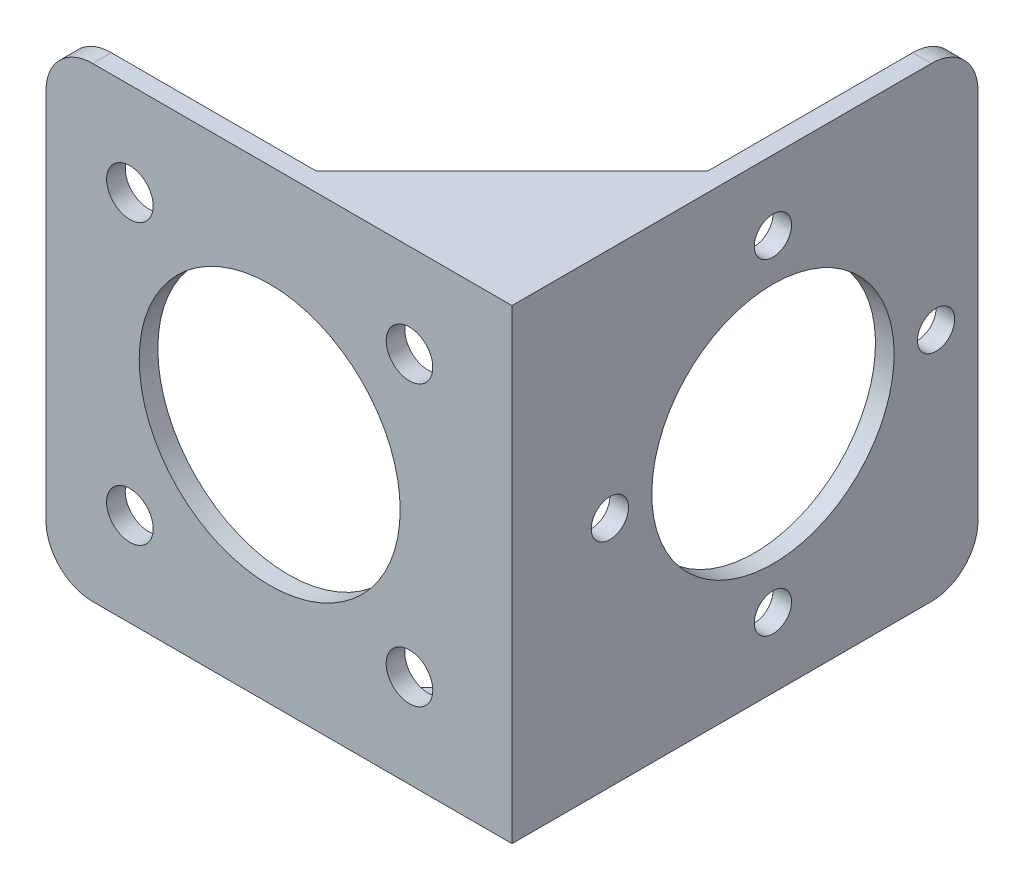
ISO-10303-21;
HEADER;
FILE_DESCRIPTION(('STEP AP214'),'2;1');
FILE_NAME('part.step','',(''),(''),'','','');
FILE_SCHEMA(('AUTOMOTIVE_DESIGN { 1 0 10303 214 1 1 1 1 }'));
ENDSEC;
DATA;
#1=APPLICATION_CONTEXT('core data for automotive mechanical design processes');
#2=APPLICATION_PROTOCOL_DEFINITION('international standard','automotive_design',2000,#1);
#3=PRODUCT_CONTEXT('',#1,'mechanical');
#4=PRODUCT('Part','Part','',(#3));
#5=PRODUCT_RELATED_PRODUCT_CATEGORY('part','',(#4));
#6=PRODUCT_DEFINITION_FORMATION('','',#4);
#7=PRODUCT_DEFINITION_CONTEXT('part definition',#1,'design');
#8=PRODUCT_DEFINITION('design','',#6,#7);
#9=PRODUCT_DEFINITION_SHAPE('','',#8);
#10=(LENGTH_UNIT() NAMED_UNIT(*) SI_UNIT(.MILLI.,.METRE.));
#11=(NAMED_UNIT(*) PLANE_ANGLE_UNIT() SI_UNIT($,.RADIAN.));
#12=(NAMED_UNIT(*) SI_UNIT($,.STERADIAN.) SOLID_ANGLE_UNIT());
#13=UNCERTAINTY_MEASURE_WITH_UNIT(LENGTH_MEASURE(1.E-05),#10,'distance_accuracy_value','');
#14=(GEOMETRIC_REPRESENTATION_CONTEXT(3) GLOBAL_UNCERTAINTY_ASSIGNED_CONTEXT((#13)) GLOBAL_UNIT_ASSIGNED_CONTEXT((#10,
#11,#12)) REPRESENTATION_CONTEXT('',''));
#15=CARTESIAN_POINT('',(0.,0.,0.));
#16=DIRECTION('',(0.,0.,1.));
#17=DIRECTION('',(1.,0.,0.));
#18=AXIS2_PLACEMENT_3D('',#15,#16,#17);
#19=CARTESIAN_POINT('',(0.,0.,0.));
#20=DIRECTION('',(0.,0.,1.));
#21=DIRECTION('',(1.,0.,0.));
#22=AXIS2_PLACEMENT_3D('',#19,#20,#21);
#23=PLANE('',#22);
#24=CARTESIAN_POINT('',(14.,15.,0.));
#25=DIRECTION('',(0.,0.,1.));
#26=DIRECTION('',(-1.,0.,0.));
#27=AXIS2_PLACEMENT_3D('',#24,#25,#26);
#28=CIRCLE('',#27,2.5);
#29=CARTESIAN_POINT('',(11.5,15.,0.));
#30=VERTEX_POINT('',#29);
#31=EDGE_CURVE('E240',#30,#30,#28,.T.);
#32=ORIENTED_EDGE('',*,*,#31,.T.);
#33=EDGE_LOOP('',(#32));
#34=FACE_BOUND('',#33,.T.);
#35=CARTESIAN_POINT('',(14.,-15.,0.));
#36=DIRECTION('',(0.,0.,1.));
#37=DIRECTION('',(1.,0.,0.));
#38=AXIS2_PLACEMENT_3D('',#35,#36,#37);
#39=CIRCLE('',#38,2.5);
#40=CARTESIAN_POINT('',(16.5,-15.,0.));
#41=VERTEX_POINT('',#40);
#42=EDGE_CURVE('E267',#41,#41,#39,.T.);
#43=ORIENTED_EDGE('',*,*,#42,.T.);
#44=EDGE_LOOP('',(#43));
#45=FACE_BOUND('',#44,.T.);
#46=CARTESIAN_POINT('',(-16.,-15.,0.));
#47=DIRECTION('',(0.,0.,1.));
#48=DIRECTION('',(-1.,0.,0.));
#49=AXIS2_PLACEMENT_3D('',#46,#47,#48);
#50=CIRCLE('',#49,2.5);
#51=CARTESIAN_POINT('',(-18.5,-15.,0.));
#52=VERTEX_POINT('',#51);
#53=EDGE_CURVE('E275',#52,#52,#50,.T.);
#54=ORIENTED_EDGE('',*,*,#53,.T.);
#55=EDGE_LOOP('',(#54));
#56=FACE_BOUND('',#55,.T.);
#57=CARTESIAN_POINT('',(-16.,15.,0.));
#58=DIRECTION('',(0.,0.,1.));
#59=DIRECTION('',(1.,0.,0.));
#60=AXIS2_PLACEMENT_3D('',#57,#58,#59);
#61=CIRCLE('',#60,2.5);
#62=CARTESIAN_POINT('',(-13.5,15.,0.));
#63=VERTEX_POINT('',#62);
#64=EDGE_CURVE('E283',#63,#63,#61,.T.);
#65=ORIENTED_EDGE('',*,*,#64,.T.);
#66=EDGE_LOOP('',(#65));
#67=FACE_BOUND('',#66,.T.);
#68=CARTESIAN_POINT('',(-0.999999999999997,0.,0.));
#69=DIRECTION('',(0.,0.,1.));
#70=DIRECTION('',(1.,0.,0.));
#71=AXIS2_PLACEMENT_3D('',#68,#69,#70);
#72=CIRCLE('',#71,14.);
#73=CARTESIAN_POINT('',(13.,0.,0.));
#74=VERTEX_POINT('',#73);
#75=EDGE_CURVE('E291',#74,#74,#72,.T.);
#76=ORIENTED_EDGE('',*,*,#75,.T.);
#77=EDGE_LOOP('',(#76));
#78=FACE_BOUND('',#77,.T.);
#79=DIRECTION('',(1.,0.,0.));
#80=VECTOR('',#79,1.);
#81=CARTESIAN_POINT('',(-25.,-25.,0.));
#82=LINE('',#81,#80);
#83=CARTESIAN_POINT('',(-20.,-25.,0.));
#84=VERTEX_POINT('',#83);
#85=CARTESIAN_POINT('',(2.,-25.,0.));
#86=VERTEX_POINT('',#85);
#87=EDGE_CURVE('E307',#84,#86,#82,.T.);
#88=ORIENTED_EDGE('',*,*,#87,.F.);
#89=CARTESIAN_POINT('',(-20.,-20.,0.));
#90=DIRECTION('',(0.,0.,1.));
#91=DIRECTION('',(1.,0.,0.));
#92=AXIS2_PLACEMENT_3D('',#89,#90,#91);
#93=CIRCLE('',#92,5.);
#94=CARTESIAN_POINT('',(-25.,-20.,0.));
#95=VERTEX_POINT('',#94);
#96=EDGE_CURVE('E195',#84,#95,#93,.F.);
#97=ORIENTED_EDGE('',*,*,#96,.T.);
#98=DIRECTION('',(0.,-1.,0.));
#99=VECTOR('',#98,1.);
#100=CARTESIAN_POINT('',(-25.,25.,0.));
#101=LINE('',#100,#99);
#102=CARTESIAN_POINT('',(-25.,20.,0.));
#103=VERTEX_POINT('',#102);
#104=EDGE_CURVE('E320',#103,#95,#101,.T.);
#105=ORIENTED_EDGE('',*,*,#104,.F.);
#106=CARTESIAN_POINT('',(-20.,20.,0.));
#107=DIRECTION('',(0.,0.,1.));
#108=DIRECTION('',(1.,0.,0.));
#109=AXIS2_PLACEMENT_3D('',#106,#107,#108);
#110=CIRCLE('',#109,5.);
#111=CARTESIAN_POINT('',(-20.,25.,0.));
#112=VERTEX_POINT('',#111);
#113=EDGE_CURVE('E192',#103,#112,#110,.F.);
#114=ORIENTED_EDGE('',*,*,#113,.T.);
#115=DIRECTION('',(-1.,0.,0.));
#116=VECTOR('',#115,1.);
#117=CARTESIAN_POINT('',(-25.,25.,0.));
#118=LINE('',#117,#116);
#119=CARTESIAN_POINT('',(1.99999999999999,25.,0.));
#120=VERTEX_POINT('',#119);
#121=EDGE_CURVE('E299',#120,#112,#118,.T.);
#122=ORIENTED_EDGE('',*,*,#121,.F.);
#123=DIRECTION('',(0.,-1.,0.));
#124=VECTOR('',#123,1.);
#125=CARTESIAN_POINT('',(2.,0.,0.));
#126=LINE('',#125,#124);
#127=CARTESIAN_POINT('',(2.,23.,0.));
#128=VERTEX_POINT('',#127);
#129=EDGE_CURVE('E162',#120,#128,#126,.T.);
#130=ORIENTED_EDGE('',*,*,#129,.T.);
#131=DIRECTION('',(-1.,0.,0.));
#132=VECTOR('',#131,1.);
#133=CARTESIAN_POINT('',(0.,23.,0.));
#134=LINE('',#133,#132);
#135=CARTESIAN_POINT('',(23.,23.,0.));
#136=VERTEX_POINT('',#135);
#137=EDGE_CURVE('E411',#136,#128,#134,.T.);
#138=ORIENTED_EDGE('',*,*,#137,.F.);
#139=DIRECTION('',(0.,1.,0.));
#140=VECTOR('',#139,1.);
#141=CARTESIAN_POINT('',(23.,25.,0.));
#142=LINE('',#141,#140);
#143=CARTESIAN_POINT('',(23.,-23.,0.));
#144=VERTEX_POINT('',#143);
#145=EDGE_CURVE('E254',#144,#136,#142,.T.);
#146=ORIENTED_EDGE('',*,*,#145,.F.);
#147=DIRECTION('',(1.,0.,0.));
#148=VECTOR('',#147,1.);
#149=CARTESIAN_POINT('',(0.,-23.,0.));
#150=LINE('',#149,#148);
#151=CARTESIAN_POINT('',(2.,-23.,0.));
#152=VERTEX_POINT('',#151);
#153=EDGE_CURVE('E389',#152,#144,#150,.T.);
#154=ORIENTED_EDGE('',*,*,#153,.F.);
#155=DIRECTION('',(0.,-1.,0.));
#156=VECTOR('',#155,1.);
#157=CARTESIAN_POINT('',(2.,0.,0.));
#158=LINE('',#157,#156);
#159=EDGE_CURVE('E165',#152,#86,#158,.T.);
#160=ORIENTED_EDGE('',*,*,#159,.T.);
#161=EDGE_LOOP('',(#88,#97,#105,#114,#122,#130,#138,#146,#154,#160));
#162=FACE_BOUND('',#161,.T.);
#163=ADVANCED_FACE('F41',(#34,#45,#56,#67,#78,#162),#23,.F.);
#164=CARTESIAN_POINT('',(0.,0.,2.));
#165=DIRECTION('',(0.,0.,1.));
#166=DIRECTION('',(1.,0.,0.));
#167=AXIS2_PLACEMENT_3D('',#164,#165,#166);
#168=PLANE('',#167);
#169=DIRECTION('',(0.,-1.,0.));
#170=VECTOR('',#169,1.);
#171=CARTESIAN_POINT('',(-25.,25.,2.));
#172=LINE('',#171,#170);
#173=CARTESIAN_POINT('',(-25.,20.,2.));
#174=VERTEX_POINT('',#173);
#175=CARTESIAN_POINT('',(-25.,-20.,2.));
#176=VERTEX_POINT('',#175);
#177=EDGE_CURVE('E311',#174,#176,#172,.T.);
#178=ORIENTED_EDGE('',*,*,#177,.T.);
#179=CARTESIAN_POINT('',(-20.,-20.,2.));
#180=DIRECTION('',(0.,0.,1.));
#181=DIRECTION('',(1.,0.,0.));
#182=AXIS2_PLACEMENT_3D('',#179,#180,#181);
#183=CIRCLE('',#182,5.);
#184=CARTESIAN_POINT('',(-20.,-25.,2.));
#185=VERTEX_POINT('',#184);
#186=EDGE_CURVE('E208',#176,#185,#183,.T.);
#187=ORIENTED_EDGE('',*,*,#186,.T.);
#188=DIRECTION('',(1.,0.,0.));
#189=VECTOR('',#188,1.);
#190=CARTESIAN_POINT('',(-25.,-25.,2.));
#191=LINE('',#190,#189);
#192=CARTESIAN_POINT('',(25.,-25.,2.));
#193=VERTEX_POINT('',#192);
#194=EDGE_CURVE('E315',#185,#193,#191,.T.);
#195=ORIENTED_EDGE('',*,*,#194,.T.);
#196=DIRECTION('',(0.,1.,0.));
#197=VECTOR('',#196,1.);
#198=CARTESIAN_POINT('',(25.,25.,2.));
#199=LINE('',#198,#197);
#200=CARTESIAN_POINT('',(25.,25.,2.));
#201=VERTEX_POINT('',#200);
#202=EDGE_CURVE('E303',#193,#201,#199,.T.);
#203=ORIENTED_EDGE('',*,*,#202,.T.);
#204=DIRECTION('',(-1.,0.,0.));
#205=VECTOR('',#204,1.);
#206=CARTESIAN_POINT('',(-25.,25.,2.));
#207=LINE('',#206,#205);
#208=CARTESIAN_POINT('',(-20.,25.,2.));
#209=VERTEX_POINT('',#208);
#210=EDGE_CURVE('E306',#201,#209,#207,.T.);
#211=ORIENTED_EDGE('',*,*,#210,.T.);
#212=CARTESIAN_POINT('',(-20.,20.,2.));
#213=DIRECTION('',(0.,0.,1.));
#214=DIRECTION('',(1.,0.,0.));
#215=AXIS2_PLACEMENT_3D('',#212,#213,#214);
#216=CIRCLE('',#215,5.);
#217=EDGE_CURVE('E205',#209,#174,#216,.T.);
#218=ORIENTED_EDGE('',*,*,#217,.T.);
#219=EDGE_LOOP('',(#178,#187,#195,#203,#211,#218));
#220=FACE_BOUND('',#219,.T.);
#221=CARTESIAN_POINT('',(14.,-15.,2.));
#222=DIRECTION('',(0.,0.,1.));
#223=DIRECTION('',(1.,0.,0.));
#224=AXIS2_PLACEMENT_3D('',#221,#222,#223);
#225=CIRCLE('',#224,2.5);
#226=CARTESIAN_POINT('',(16.5,-15.,2.));
#227=VERTEX_POINT('',#226);
#228=EDGE_CURVE('E271',#227,#227,#225,.T.);
#229=ORIENTED_EDGE('',*,*,#228,.F.);
#230=EDGE_LOOP('',(#229));
#231=FACE_BOUND('',#230,.T.);
#232=CARTESIAN_POINT('',(-16.,15.,2.));
#233=DIRECTION('',(0.,0.,1.));
#234=DIRECTION('',(1.,0.,0.));
#235=AXIS2_PLACEMENT_3D('',#232,#233,#234);
#236=CIRCLE('',#235,2.5);
#237=CARTESIAN_POINT('',(-13.5,15.,2.));
#238=VERTEX_POINT('',#237);
#239=EDGE_CURVE('E287',#238,#238,#236,.T.);
#240=ORIENTED_EDGE('',*,*,#239,.F.);
#241=EDGE_LOOP('',(#240));
#242=FACE_BOUND('',#241,.T.);
#243=CARTESIAN_POINT('',(-0.999999999999997,0.,2.));
#244=DIRECTION('',(0.,0.,1.));
#245=DIRECTION('',(1.,0.,0.));
#246=AXIS2_PLACEMENT_3D('',#243,#244,#245);
#247=CIRCLE('',#246,14.);
#248=CARTESIAN_POINT('',(13.,0.,2.));
#249=VERTEX_POINT('',#248);
#250=EDGE_CURVE('E295',#249,#249,#247,.T.);
#251=ORIENTED_EDGE('',*,*,#250,.F.);
#252=EDGE_LOOP('',(#251));
#253=FACE_BOUND('',#252,.T.);
#254=CARTESIAN_POINT('',(-16.,-15.,2.));
#255=DIRECTION('',(0.,0.,1.));
#256=DIRECTION('',(-1.,0.,0.));
#257=AXIS2_PLACEMENT_3D('',#254,#255,#256);
#258=CIRCLE('',#257,2.5);
#259=CARTESIAN_POINT('',(-18.5,-15.,2.));
#260=VERTEX_POINT('',#259);
#261=EDGE_CURVE('E279',#260,#260,#258,.T.);
#262=ORIENTED_EDGE('',*,*,#261,.F.);
#263=EDGE_LOOP('',(#262));
#264=FACE_BOUND('',#263,.T.);
#265=CARTESIAN_POINT('',(14.,15.,2.));
#266=DIRECTION('',(0.,0.,1.));
#267=DIRECTION('',(-1.,0.,0.));
#268=AXIS2_PLACEMENT_3D('',#265,#266,#267);
#269=CIRCLE('',#268,2.5);
#270=CARTESIAN_POINT('',(11.5,15.,2.));
#271=VERTEX_POINT('',#270);
#272=EDGE_CURVE('E263',#271,#271,#269,.T.);
#273=ORIENTED_EDGE('',*,*,#272,.F.);
#274=EDGE_LOOP('',(#273));
#275=FACE_BOUND('',#274,.T.);
#276=ADVANCED_FACE('F342',(#220,#231,#242,#253,#264,#275),#168,.T.);
#277=CARTESIAN_POINT('',(25.,25.,2.));
#278=DIRECTION('',(-1.,0.,0.));
#279=DIRECTION('',(0.,-1.,0.));
#280=AXIS2_PLACEMENT_3D('',#277,#278,#279);
#281=PLANE('',#280);
#282=CARTESIAN_POINT('',(25.,0.,-43.5));
#283=DIRECTION('',(1.,0.,0.));
#284=DIRECTION('',(0.,1.,0.));
#285=AXIS2_PLACEMENT_3D('',#282,#283,#284);
#286=CIRCLE('',#285,2.);
#287=CARTESIAN_POINT('',(25.,2.,-43.5));
#288=VERTEX_POINT('',#287);
#289=EDGE_CURVE('E663',#288,#288,#286,.T.);
#290=ORIENTED_EDGE('',*,*,#289,.F.);
#291=EDGE_LOOP('',(#290));
#292=FACE_BOUND('',#291,.T.);
#293=CARTESIAN_POINT('',(25.,17.5,-26.));
#294=DIRECTION('',(1.,0.,0.));
#295=DIRECTION('',(0.,1.,0.));
#296=AXIS2_PLACEMENT_3D('',#293,#294,#295);
#297=CIRCLE('',#296,2.);
#298=CARTESIAN_POINT('',(25.,19.5,-26.));
#299=VERTEX_POINT('',#298);
#300=EDGE_CURVE('E656',#299,#299,#297,.T.);
#301=ORIENTED_EDGE('',*,*,#300,.F.);
#302=EDGE_LOOP('',(#301));
#303=FACE_BOUND('',#302,.T.);
#304=CARTESIAN_POINT('',(25.,-17.5,-26.));
#305=DIRECTION('',(1.,0.,0.));
#306=DIRECTION('',(0.,-1.,0.));
#307=AXIS2_PLACEMENT_3D('',#304,#305,#306);
#308=CIRCLE('',#307,2.);
#309=CARTESIAN_POINT('',(25.,-19.5,-26.));
#310=VERTEX_POINT('',#309);
#311=EDGE_CURVE('E666',#310,#310,#308,.T.);
#312=ORIENTED_EDGE('',*,*,#311,.F.);
#313=EDGE_LOOP('',(#312));
#314=FACE_BOUND('',#313,.T.);
#315=CARTESIAN_POINT('',(25.,0.,-8.5));
#316=DIRECTION('',(1.,0.,0.));
#317=DIRECTION('',(0.,-1.,0.));
#318=AXIS2_PLACEMENT_3D('',#315,#316,#317);
#319=CIRCLE('',#318,2.);
#320=CARTESIAN_POINT('',(25.,-1.99999999999999,-8.5));
#321=VERTEX_POINT('',#320);
#322=EDGE_CURVE('E681',#321,#321,#319,.T.);
#323=ORIENTED_EDGE('',*,*,#322,.F.);
#324=EDGE_LOOP('',(#323));
#325=FACE_BOUND('',#324,.T.);
#326=CARTESIAN_POINT('',(25.,0.,-26.));
#327=DIRECTION('',(1.,0.,0.));
#328=DIRECTION('',(0.,1.,0.));
#329=AXIS2_PLACEMENT_3D('',#326,#327,#328);
#330=CIRCLE('',#329,13.);
#331=CARTESIAN_POINT('',(25.,13.,-26.));
#332=VERTEX_POINT('',#331);
#333=EDGE_CURVE('E404',#332,#332,#330,.T.);
#334=ORIENTED_EDGE('',*,*,#333,.F.);
#335=EDGE_LOOP('',(#334));
#336=FACE_BOUND('',#335,.T.);
#337=DIRECTION('',(0.,-1.,0.));
#338=VECTOR('',#337,1.);
#339=CARTESIAN_POINT('',(25.,25.,-48.));
#340=LINE('',#339,#338);
#341=CARTESIAN_POINT('',(25.,20.,-48.));
#342=VERTEX_POINT('',#341);
#343=CARTESIAN_POINT('',(25.,-20.,-48.));
#344=VERTEX_POINT('',#343);
#345=EDGE_CURVE('E247',#342,#344,#340,.T.);
#346=ORIENTED_EDGE('',*,*,#345,.F.);
#347=CARTESIAN_POINT('',(25.,20.,-43.));
#348=DIRECTION('',(-1.,0.,0.));
#349=DIRECTION('',(0.,-1.,0.));
#350=AXIS2_PLACEMENT_3D('',#347,#348,#349);
#351=CIRCLE('',#350,5.);
#352=CARTESIAN_POINT('',(25.,25.,-43.));
#353=VERTEX_POINT('',#352);
#354=EDGE_CURVE('E226',#342,#353,#351,.F.);
#355=ORIENTED_EDGE('',*,*,#354,.T.);
#356=DIRECTION('',(0.,0.,-1.));
#357=VECTOR('',#356,1.);
#358=CARTESIAN_POINT('',(25.,25.,2.));
#359=LINE('',#358,#357);
#360=EDGE_CURVE('E179',#201,#353,#359,.T.);
#361=ORIENTED_EDGE('',*,*,#360,.F.);
#362=ORIENTED_EDGE('',*,*,#202,.F.);
#363=DIRECTION('',(0.,0.,-1.));
#364=VECTOR('',#363,1.);
#365=CARTESIAN_POINT('',(25.,-25.,2.));
#366=LINE('',#365,#364);
#367=CARTESIAN_POINT('',(25.,-25.,-43.));
#368=VERTEX_POINT('',#367);
#369=EDGE_CURVE('E249',#193,#368,#366,.T.);
#370=ORIENTED_EDGE('',*,*,#369,.T.);
#371=CARTESIAN_POINT('',(25.,-20.,-43.));
#372=DIRECTION('',(-1.,0.,0.));
#373=DIRECTION('',(0.,-1.,0.));
#374=AXIS2_PLACEMENT_3D('',#371,#372,#373);
#375=CIRCLE('',#374,5.);
#376=EDGE_CURVE('E223',#368,#344,#375,.F.);
#377=ORIENTED_EDGE('',*,*,#376,.T.);
#378=EDGE_LOOP('',(#346,#355,#361,#362,#370,#377));
#379=FACE_BOUND('',#378,.T.);
#380=ADVANCED_FACE('F246',(#292,#303,#314,#325,#336,#379),#281,.F.);
#381=CARTESIAN_POINT('',(-25.,25.,2.));
#382=DIRECTION('',(0.,-1.,0.));
#383=DIRECTION('',(0.,0.,-1.));
#384=AXIS2_PLACEMENT_3D('',#381,#382,#383);
#385=PLANE('',#384);
#386=ORIENTED_EDGE('',*,*,#121,.T.);
#387=DIRECTION('',(0.,0.,-1.));
#388=VECTOR('',#387,1.);
#389=CARTESIAN_POINT('',(-20.,25.,2.));
#390=LINE('',#389,#388);
#391=EDGE_CURVE('E213',#112,#209,#390,.F.);
#392=ORIENTED_EDGE('',*,*,#391,.T.);
#393=ORIENTED_EDGE('',*,*,#210,.F.);
#394=ORIENTED_EDGE('',*,*,#360,.T.);
#395=DIRECTION('',(1.,0.,0.));
#396=VECTOR('',#395,1.);
#397=CARTESIAN_POINT('',(23.,25.,-43.));
#398=LINE('',#397,#396);
#399=CARTESIAN_POINT('',(23.,25.,-43.));
#400=VERTEX_POINT('',#399);
#401=EDGE_CURVE('E150',#353,#400,#398,.F.);
#402=ORIENTED_EDGE('',*,*,#401,.T.);
#403=DIRECTION('',(0.,0.,1.));
#404=VECTOR('',#403,1.);
#405=CARTESIAN_POINT('',(23.,25.,-48.));
#406=LINE('',#405,#404);
#407=CARTESIAN_POINT('',(23.,25.,-21.));
#408=VERTEX_POINT('',#407);
#409=EDGE_CURVE('E142',#400,#408,#406,.T.);
#410=ORIENTED_EDGE('',*,*,#409,.T.);
#411=DIRECTION('',(-0.707106781186547,0.,0.707106781186547));
#412=VECTOR('',#411,1.);
#413=CARTESIAN_POINT('',(0.,25.,2.));
#414=LINE('',#413,#412);
#415=EDGE_CURVE('E146',#408,#120,#414,.T.);
#416=ORIENTED_EDGE('',*,*,#415,.T.);
#417=EDGE_LOOP('',(#386,#392,#393,#394,#402,#410,#416));
#418=FACE_BOUND('',#417,.T.);
#419=ADVANCED_FACE('F145',(#418),#385,.F.);
#420=CARTESIAN_POINT('',(-25.,25.,2.));
#421=DIRECTION('',(1.,0.,0.));
#422=DIRECTION('',(0.,1.,0.));
#423=AXIS2_PLACEMENT_3D('',#420,#421,#422);
#424=PLANE('',#423);
#425=ORIENTED_EDGE('',*,*,#104,.T.);
#426=DIRECTION('',(0.,0.,-1.));
#427=VECTOR('',#426,1.);
#428=CARTESIAN_POINT('',(-25.,-20.,2.));
#429=LINE('',#428,#427);
#430=EDGE_CURVE('E202',#95,#176,#429,.F.);
#431=ORIENTED_EDGE('',*,*,#430,.T.);
#432=ORIENTED_EDGE('',*,*,#177,.F.);
#433=DIRECTION('',(0.,0.,-1.));
#434=VECTOR('',#433,1.);
#435=CARTESIAN_POINT('',(-25.,20.,2.));
#436=LINE('',#435,#434);
#437=EDGE_CURVE('E198',#174,#103,#436,.T.);
#438=ORIENTED_EDGE('',*,*,#437,.T.);
#439=EDGE_LOOP('',(#425,#431,#432,#438));
#440=FACE_BOUND('',#439,.T.);
#441=ADVANCED_FACE('F356',(#440),#424,.F.);
#442=CARTESIAN_POINT('',(-25.,-25.,2.));
#443=DIRECTION('',(0.,1.,0.));
#444=DIRECTION('',(0.,0.,1.));
#445=AXIS2_PLACEMENT_3D('',#442,#443,#444);
#446=PLANE('',#445);
#447=ORIENTED_EDGE('',*,*,#194,.F.);
#448=DIRECTION('',(0.,0.,-1.));
#449=VECTOR('',#448,1.);
#450=CARTESIAN_POINT('',(-20.,-25.,2.));
#451=LINE('',#450,#449);
#452=EDGE_CURVE('E188',#185,#84,#451,.T.);
#453=ORIENTED_EDGE('',*,*,#452,.T.);
#454=ORIENTED_EDGE('',*,*,#87,.T.);
#455=DIRECTION('',(0.707106781186547,0.,-0.707106781186548));
#456=VECTOR('',#455,1.);
#457=CARTESIAN_POINT('',(0.,-25.,2.));
#458=LINE('',#457,#456);
#459=CARTESIAN_POINT('',(23.,-25.,-21.));
#460=VERTEX_POINT('',#459);
#461=EDGE_CURVE('E238',#86,#460,#458,.T.);
#462=ORIENTED_EDGE('',*,*,#461,.T.);
#463=DIRECTION('',(0.,0.,1.));
#464=VECTOR('',#463,1.);
#465=CARTESIAN_POINT('',(23.,-25.,-48.));
#466=LINE('',#465,#464);
#467=CARTESIAN_POINT('',(23.,-25.,-43.));
#468=VERTEX_POINT('',#467);
#469=EDGE_CURVE('E153',#468,#460,#466,.T.);
#470=ORIENTED_EDGE('',*,*,#469,.F.);
#471=DIRECTION('',(-1.,0.,0.));
#472=VECTOR('',#471,1.);
#473=CARTESIAN_POINT('',(25.,-25.,-43.));
#474=LINE('',#473,#472);
#475=EDGE_CURVE('E185',#468,#368,#474,.F.);
#476=ORIENTED_EDGE('',*,*,#475,.T.);
#477=ORIENTED_EDGE('',*,*,#369,.F.);
#478=EDGE_LOOP('',(#447,#453,#454,#462,#470,#476,#477));
#479=FACE_BOUND('',#478,.T.);
#480=ADVANCED_FACE('F234',(#479),#446,.F.);
#481=CARTESIAN_POINT('',(-0.999999999999997,0.,2.));
#482=DIRECTION('',(0.,0.,-1.));
#483=DIRECTION('',(-1.,0.,0.));
#484=AXIS2_PLACEMENT_3D('',#481,#482,#483);
#485=CYLINDRICAL_SURFACE('',#484,14.);
#486=ORIENTED_EDGE('',*,*,#250,.T.);
#487=EDGE_LOOP('',(#486));
#488=FACE_BOUND('',#487,.T.);
#489=ORIENTED_EDGE('',*,*,#75,.F.);
#490=EDGE_LOOP('',(#489));
#491=FACE_BOUND('',#490,.T.);
#492=ADVANCED_FACE('F355',(#488,#491),#485,.F.);
#493=CARTESIAN_POINT('',(-16.,15.,2.));
#494=DIRECTION('',(0.,0.,-1.));
#495=DIRECTION('',(-1.,0.,0.));
#496=AXIS2_PLACEMENT_3D('',#493,#494,#495);
#497=CYLINDRICAL_SURFACE('',#496,2.5);
#498=ORIENTED_EDGE('',*,*,#239,.T.);
#499=EDGE_LOOP('',(#498));
#500=FACE_BOUND('',#499,.T.);
#501=ORIENTED_EDGE('',*,*,#64,.F.);
#502=EDGE_LOOP('',(#501));
#503=FACE_BOUND('',#502,.T.);
#504=ADVANCED_FACE('F452',(#500,#503),#497,.F.);
#505=CARTESIAN_POINT('',(-16.,-15.,2.));
#506=DIRECTION('',(0.,0.,-1.));
#507=DIRECTION('',(-1.,0.,0.));
#508=AXIS2_PLACEMENT_3D('',#505,#506,#507);
#509=CYLINDRICAL_SURFACE('',#508,2.5);
#510=ORIENTED_EDGE('',*,*,#261,.T.);
#511=EDGE_LOOP('',(#510));
#512=FACE_BOUND('',#511,.T.);
#513=ORIENTED_EDGE('',*,*,#53,.F.);
#514=EDGE_LOOP('',(#513));
#515=FACE_BOUND('',#514,.T.);
#516=ADVANCED_FACE('F448',(#512,#515),#509,.F.);
#517=CARTESIAN_POINT('',(14.,-15.,2.));
#518=DIRECTION('',(0.,0.,-1.));
#519=DIRECTION('',(-1.,0.,0.));
#520=AXIS2_PLACEMENT_3D('',#517,#518,#519);
#521=CYLINDRICAL_SURFACE('',#520,2.5);
#522=ORIENTED_EDGE('',*,*,#228,.T.);
#523=EDGE_LOOP('',(#522));
#524=FACE_BOUND('',#523,.T.);
#525=ORIENTED_EDGE('',*,*,#42,.F.);
#526=EDGE_LOOP('',(#525));
#527=FACE_BOUND('',#526,.T.);
#528=ADVANCED_FACE('F444',(#524,#527),#521,.F.);
#529=CARTESIAN_POINT('',(14.,15.,2.));
#530=DIRECTION('',(0.,0.,-1.));
#531=DIRECTION('',(-1.,0.,0.));
#532=AXIS2_PLACEMENT_3D('',#529,#530,#531);
#533=CYLINDRICAL_SURFACE('',#532,2.5);
#534=ORIENTED_EDGE('',*,*,#272,.T.);
#535=EDGE_LOOP('',(#534));
#536=FACE_BOUND('',#535,.T.);
#537=ORIENTED_EDGE('',*,*,#31,.F.);
#538=EDGE_LOOP('',(#537));
#539=FACE_BOUND('',#538,.T.);
#540=ADVANCED_FACE('F440',(#536,#539),#533,.F.);
#541=CARTESIAN_POINT('',(23.,25.,-48.));
#542=DIRECTION('',(1.,0.,0.));
#543=DIRECTION('',(0.,1.,0.));
#544=AXIS2_PLACEMENT_3D('',#541,#542,#543);
#545=PLANE('',#544);
#546=CARTESIAN_POINT('',(23.,0.,-43.5));
#547=DIRECTION('',(1.,0.,0.));
#548=DIRECTION('',(0.,1.,0.));
#549=AXIS2_PLACEMENT_3D('',#546,#547,#548);
#550=CIRCLE('',#549,2.);
#551=CARTESIAN_POINT('',(23.,2.,-43.5));
#552=VERTEX_POINT('',#551);
#553=EDGE_CURVE('E671',#552,#552,#550,.T.);
#554=ORIENTED_EDGE('',*,*,#553,.T.);
#555=EDGE_LOOP('',(#554));
#556=FACE_BOUND('',#555,.T.);
#557=CARTESIAN_POINT('',(23.,17.5,-26.));
#558=DIRECTION('',(1.,0.,0.));
#559=DIRECTION('',(0.,1.,0.));
#560=AXIS2_PLACEMENT_3D('',#557,#558,#559);
#561=CIRCLE('',#560,2.);
#562=CARTESIAN_POINT('',(23.,19.5,-26.));
#563=VERTEX_POINT('',#562);
#564=EDGE_CURVE('E653',#563,#563,#561,.T.);
#565=ORIENTED_EDGE('',*,*,#564,.T.);
#566=EDGE_LOOP('',(#565));
#567=FACE_BOUND('',#566,.T.);
#568=CARTESIAN_POINT('',(23.,-17.5,-26.));
#569=DIRECTION('',(1.,0.,0.));
#570=DIRECTION('',(0.,-1.,0.));
#571=AXIS2_PLACEMENT_3D('',#568,#569,#570);
#572=CIRCLE('',#571,2.);
#573=CARTESIAN_POINT('',(23.,-19.5,-26.));
#574=VERTEX_POINT('',#573);
#575=EDGE_CURVE('E659',#574,#574,#572,.T.);
#576=ORIENTED_EDGE('',*,*,#575,.T.);
#577=EDGE_LOOP('',(#576));
#578=FACE_BOUND('',#577,.T.);
#579=CARTESIAN_POINT('',(23.,0.,-8.5));
#580=DIRECTION('',(1.,0.,0.));
#581=DIRECTION('',(0.,-1.,0.));
#582=AXIS2_PLACEMENT_3D('',#579,#580,#581);
#583=CIRCLE('',#582,2.);
#584=CARTESIAN_POINT('',(23.,-1.99999999999999,-8.5));
#585=VERTEX_POINT('',#584);
#586=EDGE_CURVE('E685',#585,#585,#583,.T.);
#587=ORIENTED_EDGE('',*,*,#586,.T.);
#588=EDGE_LOOP('',(#587));
#589=FACE_BOUND('',#588,.T.);
#590=CARTESIAN_POINT('',(23.,0.,-26.));
#591=DIRECTION('',(1.,0.,0.));
#592=DIRECTION('',(0.,1.,0.));
#593=AXIS2_PLACEMENT_3D('',#590,#591,#592);
#594=CIRCLE('',#593,13.);
#595=CARTESIAN_POINT('',(23.,13.,-26.));
#596=VERTEX_POINT('',#595);
#597=EDGE_CURVE('E398',#596,#596,#594,.T.);
#598=ORIENTED_EDGE('',*,*,#597,.T.);
#599=EDGE_LOOP('',(#598));
#600=FACE_BOUND('',#599,.T.);
#601=ORIENTED_EDGE('',*,*,#409,.F.);
#602=CARTESIAN_POINT('',(23.,20.,-43.));
#603=DIRECTION('',(1.,0.,0.));
#604=DIRECTION('',(0.,1.,0.));
#605=AXIS2_PLACEMENT_3D('',#602,#603,#604);
#606=CIRCLE('',#605,5.);
#607=CARTESIAN_POINT('',(23.,20.,-48.));
#608=VERTEX_POINT('',#607);
#609=EDGE_CURVE('E11',#400,#608,#606,.F.);
#610=ORIENTED_EDGE('',*,*,#609,.T.);
#611=DIRECTION('',(0.,1.,0.));
#612=VECTOR('',#611,1.);
#613=CARTESIAN_POINT('',(23.,25.,-48.));
#614=LINE('',#613,#612);
#615=CARTESIAN_POINT('',(23.,-20.,-48.));
#616=VERTEX_POINT('',#615);
#617=EDGE_CURVE('E154',#616,#608,#614,.T.);
#618=ORIENTED_EDGE('',*,*,#617,.F.);
#619=CARTESIAN_POINT('',(23.,-20.,-43.));
#620=DIRECTION('',(1.,0.,0.));
#621=DIRECTION('',(0.,1.,0.));
#622=AXIS2_PLACEMENT_3D('',#619,#620,#621);
#623=CIRCLE('',#622,5.);
#624=EDGE_CURVE('E50',#616,#468,#623,.F.);
#625=ORIENTED_EDGE('',*,*,#624,.T.);
#626=ORIENTED_EDGE('',*,*,#469,.T.);
#627=DIRECTION('',(0.,1.,0.));
#628=VECTOR('',#627,1.);
#629=CARTESIAN_POINT('',(23.,25.,-21.));
#630=LINE('',#629,#628);
#631=CARTESIAN_POINT('',(23.,-23.,-21.));
#632=VERTEX_POINT('',#631);
#633=EDGE_CURVE('E177',#460,#632,#630,.T.);
#634=ORIENTED_EDGE('',*,*,#633,.T.);
#635=DIRECTION('',(0.,0.,-1.));
#636=VECTOR('',#635,1.);
#637=CARTESIAN_POINT('',(23.,-23.,-48.));
#638=LINE('',#637,#636);
#639=EDGE_CURVE('E172',#144,#632,#638,.T.);
#640=ORIENTED_EDGE('',*,*,#639,.F.);
#641=ORIENTED_EDGE('',*,*,#145,.T.);
#642=DIRECTION('',(0.,0.,1.));
#643=VECTOR('',#642,1.);
#644=CARTESIAN_POINT('',(23.,23.,-48.));
#645=LINE('',#644,#643);
#646=CARTESIAN_POINT('',(23.,23.,-21.));
#647=VERTEX_POINT('',#646);
#648=EDGE_CURVE('E170',#647,#136,#645,.T.);
#649=ORIENTED_EDGE('',*,*,#648,.F.);
#650=DIRECTION('',(0.,1.,0.));
#651=VECTOR('',#650,1.);
#652=CARTESIAN_POINT('',(23.,25.,-21.));
#653=LINE('',#652,#651);
#654=EDGE_CURVE('E159',#647,#408,#653,.T.);
#655=ORIENTED_EDGE('',*,*,#654,.T.);
#656=EDGE_LOOP('',(#601,#610,#618,#625,#626,#634,#640,#641,#649,#655));
#657=FACE_BOUND('',#656,.T.);
#658=ADVANCED_FACE('F168',(#556,#567,#578,#589,#600,#657),#545,.F.);
#659=CARTESIAN_POINT('',(0.,0.,-48.));
#660=DIRECTION('',(0.,0.,-1.));
#661=DIRECTION('',(-1.,0.,0.));
#662=AXIS2_PLACEMENT_3D('',#659,#660,#661);
#663=PLANE('',#662);
#664=ORIENTED_EDGE('',*,*,#617,.T.);
#665=DIRECTION('',(1.,0.,0.));
#666=VECTOR('',#665,1.);
#667=CARTESIAN_POINT('',(25.,20.,-48.));
#668=LINE('',#667,#666);
#669=EDGE_CURVE('E219',#608,#342,#668,.T.);
#670=ORIENTED_EDGE('',*,*,#669,.T.);
#671=ORIENTED_EDGE('',*,*,#345,.T.);
#672=DIRECTION('',(-1.,0.,0.));
#673=VECTOR('',#672,1.);
#674=CARTESIAN_POINT('',(23.,-20.,-48.));
#675=LINE('',#674,#673);
#676=EDGE_CURVE('E216',#344,#616,#675,.T.);
#677=ORIENTED_EDGE('',*,*,#676,.T.);
#678=EDGE_LOOP('',(#664,#670,#671,#677));
#679=FACE_BOUND('',#678,.T.);
#680=ADVANCED_FACE('F251',(#679),#663,.T.);
#681=CARTESIAN_POINT('',(0.,23.,2.));
#682=DIRECTION('',(-0.707106781186547,0.,-0.707106781186547));
#683=DIRECTION('',(-0.707106781186548,0.,0.707106781186548));
#684=AXIS2_PLACEMENT_3D('',#681,#682,#683);
#685=PLANE('',#684);
#686=ORIENTED_EDGE('',*,*,#129,.F.);
#687=ORIENTED_EDGE('',*,*,#415,.F.);
#688=ORIENTED_EDGE('',*,*,#654,.F.);
#689=DIRECTION('',(-0.707106781186547,0.,0.707106781186547));
#690=VECTOR('',#689,1.);
#691=CARTESIAN_POINT('',(0.,23.,2.));
#692=LINE('',#691,#690);
#693=EDGE_CURVE('E164',#647,#128,#692,.T.);
#694=ORIENTED_EDGE('',*,*,#693,.T.);
#695=EDGE_LOOP('',(#686,#687,#688,#694));
#696=FACE_BOUND('',#695,.T.);
#697=ADVANCED_FACE('F157',(#696),#685,.T.);
#698=CARTESIAN_POINT('',(0.,23.,0.));
#699=DIRECTION('',(0.,1.,0.));
#700=DIRECTION('',(0.,0.,1.));
#701=AXIS2_PLACEMENT_3D('',#698,#699,#700);
#702=PLANE('',#701);
#703=ORIENTED_EDGE('',*,*,#648,.T.);
#704=ORIENTED_EDGE('',*,*,#137,.T.);
#705=ORIENTED_EDGE('',*,*,#693,.F.);
#706=EDGE_LOOP('',(#703,#704,#705));
#707=FACE_BOUND('',#706,.T.);
#708=ADVANCED_FACE('F428',(#707),#702,.F.);
#709=CARTESIAN_POINT('',(0.,-23.,2.));
#710=DIRECTION('',(-0.707106781186548,0.,-0.707106781186547));
#711=DIRECTION('',(-0.707106781186547,0.,0.707106781186548));
#712=AXIS2_PLACEMENT_3D('',#709,#710,#711);
#713=PLANE('',#712);
#714=ORIENTED_EDGE('',*,*,#159,.F.);
#715=DIRECTION('',(0.707106781186547,0.,-0.707106781186548));
#716=VECTOR('',#715,1.);
#717=CARTESIAN_POINT('',(0.,-23.,2.));
#718=LINE('',#717,#716);
#719=EDGE_CURVE('E397',#152,#632,#718,.T.);
#720=ORIENTED_EDGE('',*,*,#719,.T.);
#721=ORIENTED_EDGE('',*,*,#633,.F.);
#722=ORIENTED_EDGE('',*,*,#461,.F.);
#723=EDGE_LOOP('',(#714,#720,#721,#722));
#724=FACE_BOUND('',#723,.T.);
#725=ADVANCED_FACE('F395',(#724),#713,.T.);
#726=CARTESIAN_POINT('',(0.,-23.,0.));
#727=DIRECTION('',(0.,-1.,0.));
#728=DIRECTION('',(0.,0.,-1.));
#729=AXIS2_PLACEMENT_3D('',#726,#727,#728);
#730=PLANE('',#729);
#731=ORIENTED_EDGE('',*,*,#719,.F.);
#732=ORIENTED_EDGE('',*,*,#153,.T.);
#733=ORIENTED_EDGE('',*,*,#639,.T.);
#734=EDGE_LOOP('',(#731,#732,#733));
#735=FACE_BOUND('',#734,.T.);
#736=ADVANCED_FACE('F417',(#735),#730,.F.);
#737=CARTESIAN_POINT('',(23.,0.,-26.));
#738=DIRECTION('',(1.,0.,0.));
#739=DIRECTION('',(0.,1.,0.));
#740=AXIS2_PLACEMENT_3D('',#737,#738,#739);
#741=CYLINDRICAL_SURFACE('',#740,13.);
#742=ORIENTED_EDGE('',*,*,#597,.F.);
#743=EDGE_LOOP('',(#742));
#744=FACE_BOUND('',#743,.T.);
#745=ORIENTED_EDGE('',*,*,#333,.T.);
#746=EDGE_LOOP('',(#745));
#747=FACE_BOUND('',#746,.T.);
#748=ADVANCED_FACE('F419',(#744,#747),#741,.F.);
#749=CARTESIAN_POINT('',(23.,0.,-8.5));
#750=DIRECTION('',(1.,0.,0.));
#751=DIRECTION('',(0.,1.,0.));
#752=AXIS2_PLACEMENT_3D('',#749,#750,#751);
#753=CYLINDRICAL_SURFACE('',#752,2.);
#754=ORIENTED_EDGE('',*,*,#586,.F.);
#755=EDGE_LOOP('',(#754));
#756=FACE_BOUND('',#755,.T.);
#757=ORIENTED_EDGE('',*,*,#322,.T.);
#758=EDGE_LOOP('',(#757));
#759=FACE_BOUND('',#758,.T.);
#760=ADVANCED_FACE('F425',(#756,#759),#753,.F.);
#761=CARTESIAN_POINT('',(23.,-17.5,-26.));
#762=DIRECTION('',(1.,0.,0.));
#763=DIRECTION('',(0.,1.,0.));
#764=AXIS2_PLACEMENT_3D('',#761,#762,#763);
#765=CYLINDRICAL_SURFACE('',#764,2.);
#766=ORIENTED_EDGE('',*,*,#575,.F.);
#767=EDGE_LOOP('',(#766));
#768=FACE_BOUND('',#767,.T.);
#769=ORIENTED_EDGE('',*,*,#311,.T.);
#770=EDGE_LOOP('',(#769));
#771=FACE_BOUND('',#770,.T.);
#772=ADVANCED_FACE('F536',(#768,#771),#765,.F.);
#773=CARTESIAN_POINT('',(23.,17.5,-26.));
#774=DIRECTION('',(1.,0.,0.));
#775=DIRECTION('',(0.,1.,0.));
#776=AXIS2_PLACEMENT_3D('',#773,#774,#775);
#777=CYLINDRICAL_SURFACE('',#776,2.);
#778=ORIENTED_EDGE('',*,*,#564,.F.);
#779=EDGE_LOOP('',(#778));
#780=FACE_BOUND('',#779,.T.);
#781=ORIENTED_EDGE('',*,*,#300,.T.);
#782=EDGE_LOOP('',(#781));
#783=FACE_BOUND('',#782,.T.);
#784=ADVANCED_FACE('F371',(#780,#783),#777,.F.);
#785=CARTESIAN_POINT('',(23.,0.,-43.5));
#786=DIRECTION('',(1.,0.,0.));
#787=DIRECTION('',(0.,1.,0.));
#788=AXIS2_PLACEMENT_3D('',#785,#786,#787);
#789=CYLINDRICAL_SURFACE('',#788,2.);
#790=ORIENTED_EDGE('',*,*,#553,.F.);
#791=EDGE_LOOP('',(#790));
#792=FACE_BOUND('',#791,.T.);
#793=ORIENTED_EDGE('',*,*,#289,.T.);
#794=EDGE_LOOP('',(#793));
#795=FACE_BOUND('',#794,.T.);
#796=ADVANCED_FACE('F366',(#792,#795),#789,.F.);
#797=CARTESIAN_POINT('',(-20.,-20.,2.));
#798=DIRECTION('',(0.,0.,-1.));
#799=DIRECTION('',(-1.,0.,0.));
#800=AXIS2_PLACEMENT_3D('',#797,#798,#799);
#801=CYLINDRICAL_SURFACE('',#800,5.);
#802=ORIENTED_EDGE('',*,*,#186,.F.);
#803=ORIENTED_EDGE('',*,*,#430,.F.);
#804=ORIENTED_EDGE('',*,*,#96,.F.);
#805=ORIENTED_EDGE('',*,*,#452,.F.);
#806=EDGE_LOOP('',(#802,#803,#804,#805));
#807=FACE_BOUND('',#806,.T.);
#808=ADVANCED_FACE('F338',(#807),#801,.T.);
#809=CARTESIAN_POINT('',(-20.,20.,2.));
#810=DIRECTION('',(0.,0.,-1.));
#811=DIRECTION('',(-1.,0.,0.));
#812=AXIS2_PLACEMENT_3D('',#809,#810,#811);
#813=CYLINDRICAL_SURFACE('',#812,5.);
#814=ORIENTED_EDGE('',*,*,#217,.F.);
#815=ORIENTED_EDGE('',*,*,#391,.F.);
#816=ORIENTED_EDGE('',*,*,#113,.F.);
#817=ORIENTED_EDGE('',*,*,#437,.F.);
#818=EDGE_LOOP('',(#814,#815,#816,#817));
#819=FACE_BOUND('',#818,.T.);
#820=ADVANCED_FACE('F333',(#819),#813,.T.);
#821=CARTESIAN_POINT('',(0.,20.,-43.));
#822=DIRECTION('',(-1.,0.,0.));
#823=DIRECTION('',(0.,0.,1.));
#824=AXIS2_PLACEMENT_3D('',#821,#822,#823);
#825=CYLINDRICAL_SURFACE('',#824,5.);
#826=ORIENTED_EDGE('',*,*,#609,.F.);
#827=ORIENTED_EDGE('',*,*,#401,.F.);
#828=ORIENTED_EDGE('',*,*,#354,.F.);
#829=ORIENTED_EDGE('',*,*,#669,.F.);
#830=EDGE_LOOP('',(#826,#827,#828,#829));
#831=FACE_BOUND('',#830,.T.);
#832=ADVANCED_FACE('F331',(#831),#825,.T.);
#833=CARTESIAN_POINT('',(0.,-20.,-43.));
#834=DIRECTION('',(1.,0.,0.));
#835=DIRECTION('',(0.,0.,-1.));
#836=AXIS2_PLACEMENT_3D('',#833,#834,#835);
#837=CYLINDRICAL_SURFACE('',#836,5.);
#838=ORIENTED_EDGE('',*,*,#376,.F.);
#839=ORIENTED_EDGE('',*,*,#475,.F.);
#840=ORIENTED_EDGE('',*,*,#624,.F.);
#841=ORIENTED_EDGE('',*,*,#676,.F.);
#842=EDGE_LOOP('',(#838,#839,#840,#841));
#843=FACE_BOUND('',#842,.T.);
#844=ADVANCED_FACE('F43',(#843),#837,.T.);
#845=CLOSED_SHELL('',(#163,#276,#380,#419,#441,#480,#492,#504,#516,#528,#540,#658,#680,#697,
#708,#725,#736,#748,#760,#772,#784,#796,#808,#820,#832,#844));
#846=MANIFOLD_SOLID_BREP('B2',#845);
#847=ADVANCED_BREP_SHAPE_REPRESENTATION('',(#18,#846),#14);
#848=SHAPE_DEFINITION_REPRESENTATION(#9,#847);
ENDSEC;
END-ISO-10303-21;
